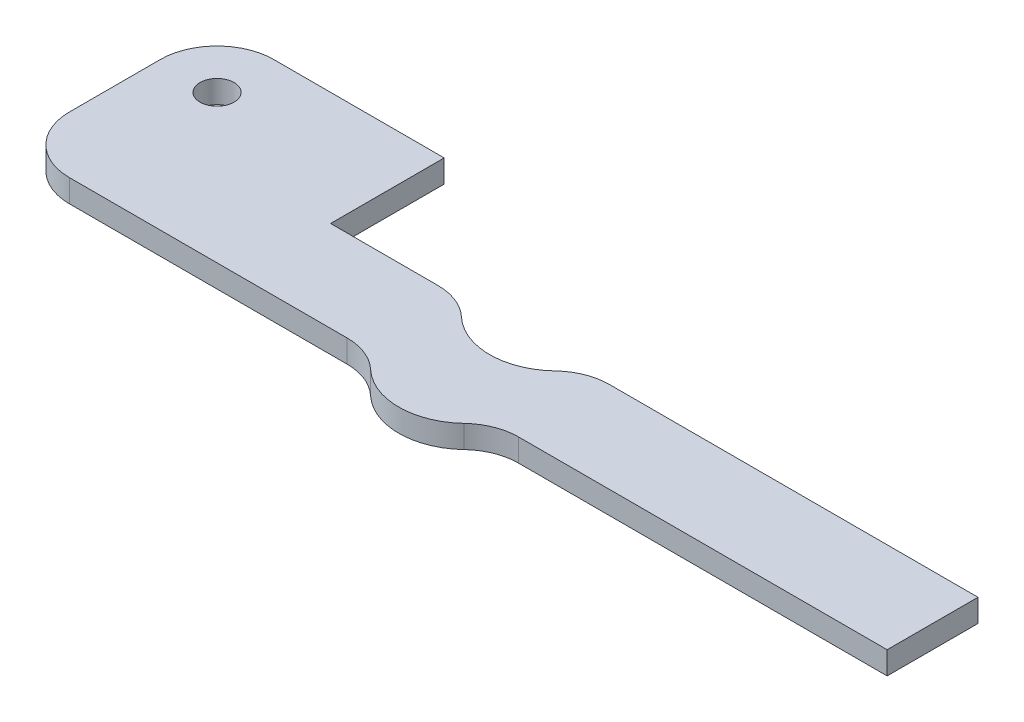
ISO-10303-21;
HEADER;
FILE_DESCRIPTION(('STEP AP214'),'2;1');
FILE_NAME('part.step','',(''),(''),'','','');
FILE_SCHEMA(('AUTOMOTIVE_DESIGN { 1 0 10303 214 1 1 1 1 }'));
ENDSEC;
DATA;
#1=APPLICATION_CONTEXT('core data for automotive mechanical design processes');
#2=APPLICATION_PROTOCOL_DEFINITION('international standard','automotive_design',2000,#1);
#3=PRODUCT_CONTEXT('',#1,'mechanical');
#4=PRODUCT('Part','Part','',(#3));
#5=PRODUCT_RELATED_PRODUCT_CATEGORY('part','',(#4));
#6=PRODUCT_DEFINITION_FORMATION('','',#4);
#7=PRODUCT_DEFINITION_CONTEXT('part definition',#1,'design');
#8=PRODUCT_DEFINITION('design','',#6,#7);
#9=PRODUCT_DEFINITION_SHAPE('','',#8);
#10=(LENGTH_UNIT() NAMED_UNIT(*) SI_UNIT(.MILLI.,.METRE.));
#11=(NAMED_UNIT(*) PLANE_ANGLE_UNIT() SI_UNIT($,.RADIAN.));
#12=(NAMED_UNIT(*) SI_UNIT($,.STERADIAN.) SOLID_ANGLE_UNIT());
#13=UNCERTAINTY_MEASURE_WITH_UNIT(LENGTH_MEASURE(1.E-05),#10,'distance_accuracy_value','');
#14=(GEOMETRIC_REPRESENTATION_CONTEXT(3) GLOBAL_UNCERTAINTY_ASSIGNED_CONTEXT((#13)) GLOBAL_UNIT_ASSIGNED_CONTEXT((#10,
#11,#12)) REPRESENTATION_CONTEXT('',''));
#15=CARTESIAN_POINT('',(0.,0.,0.));
#16=DIRECTION('',(0.,0.,1.));
#17=DIRECTION('',(1.,0.,0.));
#18=AXIS2_PLACEMENT_3D('',#15,#16,#17);
#19=CARTESIAN_POINT('',(-15.,2.,5.));
#20=DIRECTION('',(0.,0.,1.));
#21=DIRECTION('',(1.,0.,0.));
#22=AXIS2_PLACEMENT_3D('',#19,#20,#21);
#23=PLANE('',#22);
#24=DIRECTION('',(-1.,0.,0.));
#25=VECTOR('',#24,1.);
#26=CARTESIAN_POINT('',(-15.,0.,5.));
#27=LINE('',#26,#25);
#28=CARTESIAN_POINT('',(52.,0.,5.));
#29=VERTEX_POINT('',#28);
#30=CARTESIAN_POINT('',(19.5498344352708,0.,5.));
#31=VERTEX_POINT('',#30);
#32=EDGE_CURVE('E160',#29,#31,#27,.T.);
#33=ORIENTED_EDGE('',*,*,#32,.T.);
#34=DIRECTION('',(0.,1.,0.));
#35=VECTOR('',#34,1.);
#36=CARTESIAN_POINT('',(19.5498344352708,2.,5.));
#37=LINE('',#36,#35);
#38=CARTESIAN_POINT('',(19.5498344352708,2.,5.));
#39=VERTEX_POINT('',#38);
#40=EDGE_CURVE('E259',#31,#39,#37,.T.);
#41=ORIENTED_EDGE('',*,*,#40,.T.);
#42=DIRECTION('',(-1.,0.,0.));
#43=VECTOR('',#42,1.);
#44=CARTESIAN_POINT('',(-15.,2.,5.));
#45=LINE('',#44,#43);
#46=CARTESIAN_POINT('',(52.,2.,5.));
#47=VERTEX_POINT('',#46);
#48=EDGE_CURVE('E202',#47,#39,#45,.T.);
#49=ORIENTED_EDGE('',*,*,#48,.F.);
#50=DIRECTION('',(0.,-1.,0.));
#51=VECTOR('',#50,1.);
#52=CARTESIAN_POINT('',(52.,2.,5.));
#53=LINE('',#52,#51);
#54=EDGE_CURVE('E205',#47,#29,#53,.T.);
#55=ORIENTED_EDGE('',*,*,#54,.T.);
#56=EDGE_LOOP('',(#33,#41,#49,#55));
#57=FACE_BOUND('',#56,.T.);
#58=ADVANCED_FACE('F37',(#57),#23,.F.);
#59=CARTESIAN_POINT('',(12.,2.,10.));
#60=DIRECTION('',(0.,1.,0.));
#61=DIRECTION('',(0.,0.,1.));
#62=AXIS2_PLACEMENT_3D('',#59,#60,#61);
#63=PLANE('',#62);
#64=DIRECTION('',(0.,0.,1.));
#65=VECTOR('',#64,1.);
#66=CARTESIAN_POINT('',(-4.99999999999998,2.,-5.));
#67=LINE('',#66,#65);
#68=CARTESIAN_POINT('',(-4.99999999999998,2.,-5.));
#69=VERTEX_POINT('',#68);
#70=CARTESIAN_POINT('',(-4.99999999999998,2.,5.));
#71=VERTEX_POINT('',#70);
#72=EDGE_CURVE('E52',#69,#71,#67,.T.);
#73=ORIENTED_EDGE('',*,*,#72,.F.);
#74=DIRECTION('',(-1.,0.,0.));
#75=VECTOR('',#74,1.);
#76=CARTESIAN_POINT('',(-15.,2.,-5.));
#77=LINE('',#76,#75);
#78=CARTESIAN_POINT('',(-20.,2.,-5.));
#79=VERTEX_POINT('',#78);
#80=EDGE_CURVE('E151',#69,#79,#77,.T.);
#81=ORIENTED_EDGE('',*,*,#80,.T.);
#82=CARTESIAN_POINT('',(-20.,2.,0.));
#83=DIRECTION('',(0.,1.,0.));
#84=DIRECTION('',(0.,0.,1.));
#85=AXIS2_PLACEMENT_3D('',#82,#83,#84);
#86=CIRCLE('',#85,5.);
#87=CARTESIAN_POINT('',(-25.,2.,0.));
#88=VERTEX_POINT('',#87);
#89=EDGE_CURVE('E234',#79,#88,#86,.T.);
#90=ORIENTED_EDGE('',*,*,#89,.T.);
#91=DIRECTION('',(0.,0.,1.));
#92=VECTOR('',#91,1.);
#93=CARTESIAN_POINT('',(-25.,2.,-5.));
#94=LINE('',#93,#92);
#95=CARTESIAN_POINT('',(-25.,2.,8.));
#96=VERTEX_POINT('',#95);
#97=EDGE_CURVE('E159',#88,#96,#94,.T.);
#98=ORIENTED_EDGE('',*,*,#97,.T.);
#99=CARTESIAN_POINT('',(-20.,2.,8.));
#100=DIRECTION('',(0.,1.,0.));
#101=DIRECTION('',(0.,0.,1.));
#102=AXIS2_PLACEMENT_3D('',#99,#100,#101);
#103=CIRCLE('',#102,5.);
#104=CARTESIAN_POINT('',(-20.,2.,13.));
#105=VERTEX_POINT('',#104);
#106=EDGE_CURVE('E243',#96,#105,#103,.T.);
#107=ORIENTED_EDGE('',*,*,#106,.T.);
#108=DIRECTION('',(1.,0.,0.));
#109=VECTOR('',#108,1.);
#110=CARTESIAN_POINT('',(-25.,2.,13.));
#111=LINE('',#110,#109);
#112=CARTESIAN_POINT('',(4.45016556472926,2.,13.));
#113=VERTEX_POINT('',#112);
#114=EDGE_CURVE('E192',#105,#113,#111,.T.);
#115=ORIENTED_EDGE('',*,*,#114,.T.);
#116=CARTESIAN_POINT('',(4.45016556472926,2.,18.));
#117=DIRECTION('',(0.,1.,0.));
#118=DIRECTION('',(0.,0.,1.));
#119=AXIS2_PLACEMENT_3D('',#116,#117,#118);
#120=CIRCLE('',#119,5.);
#121=CARTESIAN_POINT('',(7.88190848985233,2.,14.3636363636364));
#122=VERTEX_POINT('',#121);
#123=EDGE_CURVE('E11',#113,#122,#120,.F.);
#124=ORIENTED_EDGE('',*,*,#123,.T.);
#125=CARTESIAN_POINT('',(12.,2.,10.));
#126=DIRECTION('',(0.,1.,0.));
#127=DIRECTION('',(0.,0.,1.));
#128=AXIS2_PLACEMENT_3D('',#125,#126,#127);
#129=CIRCLE('',#128,6.);
#130=CARTESIAN_POINT('',(16.1180915101477,2.,14.3636363636364));
#131=VERTEX_POINT('',#130);
#132=EDGE_CURVE('E195',#122,#131,#129,.T.);
#133=ORIENTED_EDGE('',*,*,#132,.T.);
#134=CARTESIAN_POINT('',(19.5498344352708,2.,18.));
#135=DIRECTION('',(0.,1.,0.));
#136=DIRECTION('',(0.,0.,1.));
#137=AXIS2_PLACEMENT_3D('',#134,#135,#136);
#138=CIRCLE('',#137,5.);
#139=CARTESIAN_POINT('',(19.5498344352708,2.,13.));
#140=VERTEX_POINT('',#139);
#141=EDGE_CURVE('E273',#131,#140,#138,.F.);
#142=ORIENTED_EDGE('',*,*,#141,.T.);
#143=DIRECTION('',(1.,0.,0.));
#144=VECTOR('',#143,1.);
#145=CARTESIAN_POINT('',(17.1961524227066,2.,13.));
#146=LINE('',#145,#144);
#147=CARTESIAN_POINT('',(52.,2.,13.));
#148=VERTEX_POINT('',#147);
#149=EDGE_CURVE('E198',#140,#148,#146,.T.);
#150=ORIENTED_EDGE('',*,*,#149,.T.);
#151=DIRECTION('',(0.,0.,-1.));
#152=VECTOR('',#151,1.);
#153=CARTESIAN_POINT('',(52.,2.,13.));
#154=LINE('',#153,#152);
#155=EDGE_CURVE('E200',#148,#47,#154,.T.);
#156=ORIENTED_EDGE('',*,*,#155,.T.);
#157=ORIENTED_EDGE('',*,*,#48,.T.);
#158=CARTESIAN_POINT('',(19.5498344352708,2.,10.));
#159=DIRECTION('',(0.,1.,0.));
#160=DIRECTION('',(0.,0.,1.));
#161=AXIS2_PLACEMENT_3D('',#158,#159,#160);
#162=CIRCLE('',#161,5.);
#163=CARTESIAN_POINT('',(16.1180915101477,2.,6.36363636363637));
#164=VERTEX_POINT('',#163);
#165=EDGE_CURVE('E60',#39,#164,#162,.T.);
#166=ORIENTED_EDGE('',*,*,#165,.T.);
#167=CARTESIAN_POINT('',(12.,2.,2.));
#168=DIRECTION('',(0.,1.,0.));
#169=DIRECTION('',(0.,0.,1.));
#170=AXIS2_PLACEMENT_3D('',#167,#168,#169);
#171=CIRCLE('',#170,6.);
#172=CARTESIAN_POINT('',(7.88190848985233,2.,6.36363636363636));
#173=VERTEX_POINT('',#172);
#174=EDGE_CURVE('E177',#173,#164,#171,.T.);
#175=ORIENTED_EDGE('',*,*,#174,.F.);
#176=CARTESIAN_POINT('',(4.45016556472926,2.,10.));
#177=DIRECTION('',(0.,1.,0.));
#178=DIRECTION('',(0.,0.,1.));
#179=AXIS2_PLACEMENT_3D('',#176,#177,#178);
#180=CIRCLE('',#179,5.);
#181=CARTESIAN_POINT('',(4.45016556472926,2.,5.));
#182=VERTEX_POINT('',#181);
#183=EDGE_CURVE('E257',#173,#182,#180,.T.);
#184=ORIENTED_EDGE('',*,*,#183,.T.);
#185=EDGE_CURVE('E166',#182,#71,#45,.T.);
#186=ORIENTED_EDGE('',*,*,#185,.T.);
#187=EDGE_LOOP('',(#73,#81,#90,#98,#107,#115,#124,#133,#142,#150,#156,#157,#166,#175,#184,#186));
#188=FACE_BOUND('',#187,.T.);
#189=CARTESIAN_POINT('',(-20.,2.,0.));
#190=DIRECTION('',(0.,1.,0.));
#191=DIRECTION('',(0.,0.,1.));
#192=AXIS2_PLACEMENT_3D('',#189,#190,#191);
#193=CIRCLE('',#192,1.5);
#194=CARTESIAN_POINT('',(-20.,2.,1.5));
#195=VERTEX_POINT('',#194);
#196=EDGE_CURVE('E184',#195,#195,#193,.T.);
#197=ORIENTED_EDGE('',*,*,#196,.F.);
#198=EDGE_LOOP('',(#197));
#199=FACE_BOUND('',#198,.T.);
#200=ADVANCED_FACE('F163',(#188,#199),#63,.T.);
#201=CARTESIAN_POINT('',(12.,0.,10.));
#202=DIRECTION('',(0.,1.,0.));
#203=DIRECTION('',(0.,0.,1.));
#204=AXIS2_PLACEMENT_3D('',#201,#202,#203);
#205=PLANE('',#204);
#206=DIRECTION('',(-1.,0.,0.));
#207=VECTOR('',#206,1.);
#208=CARTESIAN_POINT('',(-15.,0.,-5.));
#209=LINE('',#208,#207);
#210=CARTESIAN_POINT('',(-4.99999999999998,0.,-5.));
#211=VERTEX_POINT('',#210);
#212=CARTESIAN_POINT('',(-20.,0.,-5.));
#213=VERTEX_POINT('',#212);
#214=EDGE_CURVE('E187',#211,#213,#209,.T.);
#215=ORIENTED_EDGE('',*,*,#214,.F.);
#216=DIRECTION('',(0.,0.,-1.));
#217=VECTOR('',#216,1.);
#218=CARTESIAN_POINT('',(-4.99999999999998,0.,-5.));
#219=LINE('',#218,#217);
#220=CARTESIAN_POINT('',(-4.99999999999998,0.,5.));
#221=VERTEX_POINT('',#220);
#222=EDGE_CURVE('E172',#221,#211,#219,.T.);
#223=ORIENTED_EDGE('',*,*,#222,.F.);
#224=CARTESIAN_POINT('',(4.45016556472926,0.,5.));
#225=VERTEX_POINT('',#224);
#226=EDGE_CURVE('E220',#225,#221,#27,.T.);
#227=ORIENTED_EDGE('',*,*,#226,.F.);
#228=CARTESIAN_POINT('',(4.45016556472926,0.,10.));
#229=DIRECTION('',(0.,1.,0.));
#230=DIRECTION('',(0.,0.,1.));
#231=AXIS2_PLACEMENT_3D('',#228,#229,#230);
#232=CIRCLE('',#231,5.);
#233=CARTESIAN_POINT('',(7.88190848985233,0.,6.36363636363636));
#234=VERTEX_POINT('',#233);
#235=EDGE_CURVE('E250',#225,#234,#232,.F.);
#236=ORIENTED_EDGE('',*,*,#235,.T.);
#237=CARTESIAN_POINT('',(12.,0.,2.));
#238=DIRECTION('',(0.,1.,0.));
#239=DIRECTION('',(0.,0.,1.));
#240=AXIS2_PLACEMENT_3D('',#237,#238,#239);
#241=CIRCLE('',#240,6.);
#242=CARTESIAN_POINT('',(16.1180915101477,0.,6.36363636363637));
#243=VERTEX_POINT('',#242);
#244=EDGE_CURVE('E180',#234,#243,#241,.T.);
#245=ORIENTED_EDGE('',*,*,#244,.T.);
#246=CARTESIAN_POINT('',(19.5498344352708,0.,10.));
#247=DIRECTION('',(0.,1.,0.));
#248=DIRECTION('',(0.,0.,1.));
#249=AXIS2_PLACEMENT_3D('',#246,#247,#248);
#250=CIRCLE('',#249,5.);
#251=EDGE_CURVE('E248',#243,#31,#250,.F.);
#252=ORIENTED_EDGE('',*,*,#251,.T.);
#253=ORIENTED_EDGE('',*,*,#32,.F.);
#254=DIRECTION('',(0.,0.,-1.));
#255=VECTOR('',#254,1.);
#256=CARTESIAN_POINT('',(52.,0.,13.));
#257=LINE('',#256,#255);
#258=CARTESIAN_POINT('',(52.,0.,13.));
#259=VERTEX_POINT('',#258);
#260=EDGE_CURVE('E218',#259,#29,#257,.T.);
#261=ORIENTED_EDGE('',*,*,#260,.F.);
#262=DIRECTION('',(1.,0.,0.));
#263=VECTOR('',#262,1.);
#264=CARTESIAN_POINT('',(17.1961524227066,0.,13.));
#265=LINE('',#264,#263);
#266=CARTESIAN_POINT('',(19.5498344352708,0.,13.));
#267=VERTEX_POINT('',#266);
#268=EDGE_CURVE('E216',#267,#259,#265,.T.);
#269=ORIENTED_EDGE('',*,*,#268,.F.);
#270=CARTESIAN_POINT('',(19.5498344352708,0.,18.));
#271=DIRECTION('',(0.,1.,0.));
#272=DIRECTION('',(0.,0.,1.));
#273=AXIS2_PLACEMENT_3D('',#270,#271,#272);
#274=CIRCLE('',#273,5.);
#275=CARTESIAN_POINT('',(16.1180915101477,0.,14.3636363636364));
#276=VERTEX_POINT('',#275);
#277=EDGE_CURVE('E271',#267,#276,#274,.T.);
#278=ORIENTED_EDGE('',*,*,#277,.T.);
#279=CARTESIAN_POINT('',(12.,0.,10.));
#280=DIRECTION('',(0.,1.,0.));
#281=DIRECTION('',(0.,0.,1.));
#282=AXIS2_PLACEMENT_3D('',#279,#280,#281);
#283=CIRCLE('',#282,6.);
#284=CARTESIAN_POINT('',(7.88190848985233,0.,14.3636363636364));
#285=VERTEX_POINT('',#284);
#286=EDGE_CURVE('E213',#285,#276,#283,.T.);
#287=ORIENTED_EDGE('',*,*,#286,.F.);
#288=CARTESIAN_POINT('',(4.45016556472926,0.,18.));
#289=DIRECTION('',(0.,1.,0.));
#290=DIRECTION('',(0.,0.,1.));
#291=AXIS2_PLACEMENT_3D('',#288,#289,#290);
#292=CIRCLE('',#291,5.);
#293=CARTESIAN_POINT('',(4.45016556472926,0.,13.));
#294=VERTEX_POINT('',#293);
#295=EDGE_CURVE('E45',#285,#294,#292,.T.);
#296=ORIENTED_EDGE('',*,*,#295,.T.);
#297=DIRECTION('',(1.,0.,0.));
#298=VECTOR('',#297,1.);
#299=CARTESIAN_POINT('',(-25.,0.,13.));
#300=LINE('',#299,#298);
#301=CARTESIAN_POINT('',(-20.,0.,13.));
#302=VERTEX_POINT('',#301);
#303=EDGE_CURVE('E210',#302,#294,#300,.T.);
#304=ORIENTED_EDGE('',*,*,#303,.F.);
#305=CARTESIAN_POINT('',(-20.,0.,8.));
#306=DIRECTION('',(0.,1.,0.));
#307=DIRECTION('',(0.,0.,1.));
#308=AXIS2_PLACEMENT_3D('',#305,#306,#307);
#309=CIRCLE('',#308,5.);
#310=CARTESIAN_POINT('',(-25.,0.,8.));
#311=VERTEX_POINT('',#310);
#312=EDGE_CURVE('E239',#302,#311,#309,.F.);
#313=ORIENTED_EDGE('',*,*,#312,.T.);
#314=DIRECTION('',(0.,0.,1.));
#315=VECTOR('',#314,1.);
#316=CARTESIAN_POINT('',(-25.,0.,-5.));
#317=LINE('',#316,#315);
#318=CARTESIAN_POINT('',(-25.,0.,0.));
#319=VERTEX_POINT('',#318);
#320=EDGE_CURVE('E207',#319,#311,#317,.T.);
#321=ORIENTED_EDGE('',*,*,#320,.F.);
#322=CARTESIAN_POINT('',(-20.,0.,0.));
#323=DIRECTION('',(0.,1.,0.));
#324=DIRECTION('',(0.,0.,1.));
#325=AXIS2_PLACEMENT_3D('',#322,#323,#324);
#326=CIRCLE('',#325,5.);
#327=EDGE_CURVE('E231',#319,#213,#326,.F.);
#328=ORIENTED_EDGE('',*,*,#327,.T.);
#329=EDGE_LOOP('',(#215,#223,#227,#236,#245,#252,#253,#261,#269,#278,#287,#296,#304,#313,#321,#328));
#330=FACE_BOUND('',#329,.T.);
#331=CARTESIAN_POINT('',(-20.,0.,0.));
#332=DIRECTION('',(0.,1.,0.));
#333=DIRECTION('',(0.,0.,1.));
#334=AXIS2_PLACEMENT_3D('',#331,#332,#333);
#335=CIRCLE('',#334,1.5);
#336=CARTESIAN_POINT('',(-20.,0.,1.5));
#337=VERTEX_POINT('',#336);
#338=EDGE_CURVE('E183',#337,#337,#335,.T.);
#339=ORIENTED_EDGE('',*,*,#338,.T.);
#340=EDGE_LOOP('',(#339));
#341=FACE_BOUND('',#340,.T.);
#342=ADVANCED_FACE('F277',(#330,#341),#205,.F.);
#343=CARTESIAN_POINT('',(-15.,2.,-5.));
#344=DIRECTION('',(0.,0.,1.));
#345=DIRECTION('',(1.,0.,0.));
#346=AXIS2_PLACEMENT_3D('',#343,#344,#345);
#347=PLANE('',#346);
#348=ORIENTED_EDGE('',*,*,#214,.T.);
#349=DIRECTION('',(0.,-1.,0.));
#350=VECTOR('',#349,1.);
#351=CARTESIAN_POINT('',(-20.,2.,-5.));
#352=LINE('',#351,#350);
#353=EDGE_CURVE('E156',#213,#79,#352,.F.);
#354=ORIENTED_EDGE('',*,*,#353,.T.);
#355=ORIENTED_EDGE('',*,*,#80,.F.);
#356=DIRECTION('',(0.,1.,0.));
#357=VECTOR('',#356,1.);
#358=CARTESIAN_POINT('',(-4.99999999999998,0.,-5.));
#359=LINE('',#358,#357);
#360=EDGE_CURVE('E154',#211,#69,#359,.T.);
#361=ORIENTED_EDGE('',*,*,#360,.F.);
#362=EDGE_LOOP('',(#348,#354,#355,#361));
#363=FACE_BOUND('',#362,.T.);
#364=ADVANCED_FACE('F153',(#363),#347,.F.);
#365=CARTESIAN_POINT('',(-25.,2.,-5.));
#366=DIRECTION('',(1.,0.,0.));
#367=DIRECTION('',(0.,0.,-1.));
#368=AXIS2_PLACEMENT_3D('',#365,#366,#367);
#369=PLANE('',#368);
#370=ORIENTED_EDGE('',*,*,#320,.T.);
#371=DIRECTION('',(0.,-1.,0.));
#372=VECTOR('',#371,1.);
#373=CARTESIAN_POINT('',(-25.,2.,8.));
#374=LINE('',#373,#372);
#375=EDGE_CURVE('E241',#311,#96,#374,.F.);
#376=ORIENTED_EDGE('',*,*,#375,.T.);
#377=ORIENTED_EDGE('',*,*,#97,.F.);
#378=DIRECTION('',(0.,-1.,0.));
#379=VECTOR('',#378,1.);
#380=CARTESIAN_POINT('',(-25.,2.,0.));
#381=LINE('',#380,#379);
#382=EDGE_CURVE('E228',#88,#319,#381,.T.);
#383=ORIENTED_EDGE('',*,*,#382,.T.);
#384=EDGE_LOOP('',(#370,#376,#377,#383));
#385=FACE_BOUND('',#384,.T.);
#386=ADVANCED_FACE('F330',(#385),#369,.F.);
#387=CARTESIAN_POINT('',(-25.,2.,13.));
#388=DIRECTION('',(0.,0.,-1.));
#389=DIRECTION('',(-1.,0.,0.));
#390=AXIS2_PLACEMENT_3D('',#387,#388,#389);
#391=PLANE('',#390);
#392=ORIENTED_EDGE('',*,*,#303,.T.);
#393=DIRECTION('',(0.,1.,0.));
#394=VECTOR('',#393,1.);
#395=CARTESIAN_POINT('',(4.45016556472926,2.,13.));
#396=LINE('',#395,#394);
#397=EDGE_CURVE('E269',#294,#113,#396,.T.);
#398=ORIENTED_EDGE('',*,*,#397,.T.);
#399=ORIENTED_EDGE('',*,*,#114,.F.);
#400=DIRECTION('',(0.,-1.,0.));
#401=VECTOR('',#400,1.);
#402=CARTESIAN_POINT('',(-20.,2.,13.));
#403=LINE('',#402,#401);
#404=EDGE_CURVE('E236',#105,#302,#403,.T.);
#405=ORIENTED_EDGE('',*,*,#404,.T.);
#406=EDGE_LOOP('',(#392,#398,#399,#405));
#407=FACE_BOUND('',#406,.T.);
#408=ADVANCED_FACE('F283',(#407),#391,.F.);
#409=CARTESIAN_POINT('',(12.,2.,10.));
#410=DIRECTION('',(0.,-1.,0.));
#411=DIRECTION('',(0.,0.,-1.));
#412=AXIS2_PLACEMENT_3D('',#409,#410,#411);
#413=CYLINDRICAL_SURFACE('',#412,6.);
#414=ORIENTED_EDGE('',*,*,#286,.T.);
#415=DIRECTION('',(0.,-1.,0.));
#416=VECTOR('',#415,1.);
#417=CARTESIAN_POINT('',(16.1180915101477,2.,14.3636363636364));
#418=LINE('',#417,#416);
#419=EDGE_CURVE('E267',#276,#131,#418,.F.);
#420=ORIENTED_EDGE('',*,*,#419,.T.);
#421=ORIENTED_EDGE('',*,*,#132,.F.);
#422=DIRECTION('',(0.,-1.,0.));
#423=VECTOR('',#422,1.);
#424=CARTESIAN_POINT('',(7.88190848985233,2.,14.3636363636364));
#425=LINE('',#424,#423);
#426=EDGE_CURVE('E264',#122,#285,#425,.T.);
#427=ORIENTED_EDGE('',*,*,#426,.T.);
#428=EDGE_LOOP('',(#414,#420,#421,#427));
#429=FACE_BOUND('',#428,.T.);
#430=ADVANCED_FACE('F290',(#429),#413,.T.);
#431=CARTESIAN_POINT('',(17.1961524227066,2.,13.));
#432=DIRECTION('',(0.,0.,-1.));
#433=DIRECTION('',(-1.,0.,0.));
#434=AXIS2_PLACEMENT_3D('',#431,#432,#433);
#435=PLANE('',#434);
#436=ORIENTED_EDGE('',*,*,#149,.F.);
#437=DIRECTION('',(0.,1.,0.));
#438=VECTOR('',#437,1.);
#439=CARTESIAN_POINT('',(19.5498344352708,0.,13.));
#440=LINE('',#439,#438);
#441=EDGE_CURVE('E261',#140,#267,#440,.F.);
#442=ORIENTED_EDGE('',*,*,#441,.T.);
#443=ORIENTED_EDGE('',*,*,#268,.T.);
#444=DIRECTION('',(0.,-1.,0.));
#445=VECTOR('',#444,1.);
#446=CARTESIAN_POINT('',(52.,2.,13.));
#447=LINE('',#446,#445);
#448=EDGE_CURVE('E225',#148,#259,#447,.T.);
#449=ORIENTED_EDGE('',*,*,#448,.F.);
#450=EDGE_LOOP('',(#436,#442,#443,#449));
#451=FACE_BOUND('',#450,.T.);
#452=ADVANCED_FACE('F298',(#451),#435,.F.);
#453=CARTESIAN_POINT('',(52.,2.,13.));
#454=DIRECTION('',(-1.,0.,0.));
#455=DIRECTION('',(0.,0.,1.));
#456=AXIS2_PLACEMENT_3D('',#453,#454,#455);
#457=PLANE('',#456);
#458=ORIENTED_EDGE('',*,*,#260,.T.);
#459=ORIENTED_EDGE('',*,*,#54,.F.);
#460=ORIENTED_EDGE('',*,*,#155,.F.);
#461=ORIENTED_EDGE('',*,*,#448,.T.);
#462=EDGE_LOOP('',(#458,#459,#460,#461));
#463=FACE_BOUND('',#462,.T.);
#464=ADVANCED_FACE('F304',(#463),#457,.F.);
#465=ORIENTED_EDGE('',*,*,#226,.T.);
#466=DIRECTION('',(0.,-1.,0.));
#467=VECTOR('',#466,1.);
#468=CARTESIAN_POINT('',(-4.99999999999998,0.,5.));
#469=LINE('',#468,#467);
#470=EDGE_CURVE('E167',#71,#221,#469,.T.);
#471=ORIENTED_EDGE('',*,*,#470,.F.);
#472=ORIENTED_EDGE('',*,*,#185,.F.);
#473=DIRECTION('',(0.,1.,0.));
#474=VECTOR('',#473,1.);
#475=CARTESIAN_POINT('',(4.45016556472926,2.,5.));
#476=LINE('',#475,#474);
#477=EDGE_CURVE('E245',#182,#225,#476,.F.);
#478=ORIENTED_EDGE('',*,*,#477,.T.);
#479=EDGE_LOOP('',(#465,#471,#472,#478));
#480=FACE_BOUND('',#479,.T.);
#481=ADVANCED_FACE('F322',(#480),#23,.F.);
#482=CARTESIAN_POINT('',(-20.,2.,0.));
#483=DIRECTION('',(0.,-1.,0.));
#484=DIRECTION('',(0.,0.,-1.));
#485=AXIS2_PLACEMENT_3D('',#482,#483,#484);
#486=CYLINDRICAL_SURFACE('',#485,1.5);
#487=ORIENTED_EDGE('',*,*,#196,.T.);
#488=EDGE_LOOP('',(#487));
#489=FACE_BOUND('',#488,.T.);
#490=ORIENTED_EDGE('',*,*,#338,.F.);
#491=EDGE_LOOP('',(#490));
#492=FACE_BOUND('',#491,.T.);
#493=ADVANCED_FACE('F341',(#489,#492),#486,.F.);
#494=CARTESIAN_POINT('',(-20.,2.,0.));
#495=DIRECTION('',(0.,-1.,0.));
#496=DIRECTION('',(0.,0.,-1.));
#497=AXIS2_PLACEMENT_3D('',#494,#495,#496);
#498=CYLINDRICAL_SURFACE('',#497,5.);
#499=ORIENTED_EDGE('',*,*,#89,.F.);
#500=ORIENTED_EDGE('',*,*,#353,.F.);
#501=ORIENTED_EDGE('',*,*,#327,.F.);
#502=ORIENTED_EDGE('',*,*,#382,.F.);
#503=EDGE_LOOP('',(#499,#500,#501,#502));
#504=FACE_BOUND('',#503,.T.);
#505=ADVANCED_FACE('F325',(#504),#498,.T.);
#506=CARTESIAN_POINT('',(-20.,2.,8.));
#507=DIRECTION('',(0.,-1.,0.));
#508=DIRECTION('',(0.,0.,-1.));
#509=AXIS2_PLACEMENT_3D('',#506,#507,#508);
#510=CYLINDRICAL_SURFACE('',#509,5.);
#511=ORIENTED_EDGE('',*,*,#106,.F.);
#512=ORIENTED_EDGE('',*,*,#375,.F.);
#513=ORIENTED_EDGE('',*,*,#312,.F.);
#514=ORIENTED_EDGE('',*,*,#404,.F.);
#515=EDGE_LOOP('',(#511,#512,#513,#514));
#516=FACE_BOUND('',#515,.T.);
#517=ADVANCED_FACE('F333',(#516),#510,.T.);
#518=CARTESIAN_POINT('',(12.,-8.,2.));
#519=DIRECTION('',(0.,1.,0.));
#520=DIRECTION('',(0.,0.,1.));
#521=AXIS2_PLACEMENT_3D('',#518,#519,#520);
#522=CYLINDRICAL_SURFACE('',#521,6.);
#523=ORIENTED_EDGE('',*,*,#244,.F.);
#524=DIRECTION('',(0.,1.,0.));
#525=VECTOR('',#524,1.);
#526=CARTESIAN_POINT('',(7.88190848985233,-8.,6.36363636363636));
#527=LINE('',#526,#525);
#528=EDGE_CURVE('E254',#234,#173,#527,.T.);
#529=ORIENTED_EDGE('',*,*,#528,.T.);
#530=ORIENTED_EDGE('',*,*,#174,.T.);
#531=DIRECTION('',(0.,1.,0.));
#532=VECTOR('',#531,1.);
#533=CARTESIAN_POINT('',(16.1180915101477,-8.,6.36363636363636));
#534=LINE('',#533,#532);
#535=EDGE_CURVE('E252',#164,#243,#534,.F.);
#536=ORIENTED_EDGE('',*,*,#535,.T.);
#537=EDGE_LOOP('',(#523,#529,#530,#536));
#538=FACE_BOUND('',#537,.T.);
#539=ADVANCED_FACE('F315',(#538),#522,.F.);
#540=CARTESIAN_POINT('',(4.45016556472926,-8.,10.));
#541=DIRECTION('',(0.,1.,0.));
#542=DIRECTION('',(0.,0.,1.));
#543=AXIS2_PLACEMENT_3D('',#540,#541,#542);
#544=CYLINDRICAL_SURFACE('',#543,5.);
#545=ORIENTED_EDGE('',*,*,#183,.F.);
#546=ORIENTED_EDGE('',*,*,#528,.F.);
#547=ORIENTED_EDGE('',*,*,#235,.F.);
#548=ORIENTED_EDGE('',*,*,#477,.F.);
#549=EDGE_LOOP('',(#545,#546,#547,#548));
#550=FACE_BOUND('',#549,.T.);
#551=ADVANCED_FACE('F318',(#550),#544,.T.);
#552=CARTESIAN_POINT('',(19.5498344352708,-8.,10.));
#553=DIRECTION('',(0.,1.,0.));
#554=DIRECTION('',(0.,0.,1.));
#555=AXIS2_PLACEMENT_3D('',#552,#553,#554);
#556=CYLINDRICAL_SURFACE('',#555,5.);
#557=ORIENTED_EDGE('',*,*,#251,.F.);
#558=ORIENTED_EDGE('',*,*,#535,.F.);
#559=ORIENTED_EDGE('',*,*,#165,.F.);
#560=ORIENTED_EDGE('',*,*,#40,.F.);
#561=EDGE_LOOP('',(#557,#558,#559,#560));
#562=FACE_BOUND('',#561,.T.);
#563=ADVANCED_FACE('F310',(#562),#556,.T.);
#564=CARTESIAN_POINT('',(19.5498344352708,2.,18.));
#565=DIRECTION('',(0.,-1.,0.));
#566=DIRECTION('',(0.,0.,-1.));
#567=AXIS2_PLACEMENT_3D('',#564,#565,#566);
#568=CYLINDRICAL_SURFACE('',#567,5.);
#569=ORIENTED_EDGE('',*,*,#141,.F.);
#570=ORIENTED_EDGE('',*,*,#419,.F.);
#571=ORIENTED_EDGE('',*,*,#277,.F.);
#572=ORIENTED_EDGE('',*,*,#441,.F.);
#573=EDGE_LOOP('',(#569,#570,#571,#572));
#574=FACE_BOUND('',#573,.T.);
#575=ADVANCED_FACE('F293',(#574),#568,.F.);
#576=CARTESIAN_POINT('',(4.45016556472926,2.,18.));
#577=DIRECTION('',(0.,-1.,0.));
#578=DIRECTION('',(0.,0.,-1.));
#579=AXIS2_PLACEMENT_3D('',#576,#577,#578);
#580=CYLINDRICAL_SURFACE('',#579,5.);
#581=ORIENTED_EDGE('',*,*,#123,.F.);
#582=ORIENTED_EDGE('',*,*,#397,.F.);
#583=ORIENTED_EDGE('',*,*,#295,.F.);
#584=ORIENTED_EDGE('',*,*,#426,.F.);
#585=EDGE_LOOP('',(#581,#582,#583,#584));
#586=FACE_BOUND('',#585,.T.);
#587=ADVANCED_FACE('F39',(#586),#580,.F.);
#588=CARTESIAN_POINT('',(-4.99999999999998,0.,0.));
#589=DIRECTION('',(1.,0.,0.));
#590=DIRECTION('',(0.,0.,-1.));
#591=AXIS2_PLACEMENT_3D('',#588,#589,#590);
#592=PLANE('',#591);
#593=ORIENTED_EDGE('',*,*,#360,.T.);
#594=ORIENTED_EDGE('',*,*,#72,.T.);
#595=ORIENTED_EDGE('',*,*,#470,.T.);
#596=ORIENTED_EDGE('',*,*,#222,.T.);
#597=EDGE_LOOP('',(#593,#594,#595,#596));
#598=FACE_BOUND('',#597,.T.);
#599=ADVANCED_FACE('F170',(#598),#592,.T.);
#600=CLOSED_SHELL('',(#58,#200,#342,#364,#386,#408,#430,#452,#464,#481,#493,#505,#517,#539,#551,
#563,#575,#587,#599));
#601=MANIFOLD_SOLID_BREP('B2',#600);
#602=ADVANCED_BREP_SHAPE_REPRESENTATION('',(#18,#601),#14);
#603=SHAPE_DEFINITION_REPRESENTATION(#9,#602);
ENDSEC;
END-ISO-10303-21;
